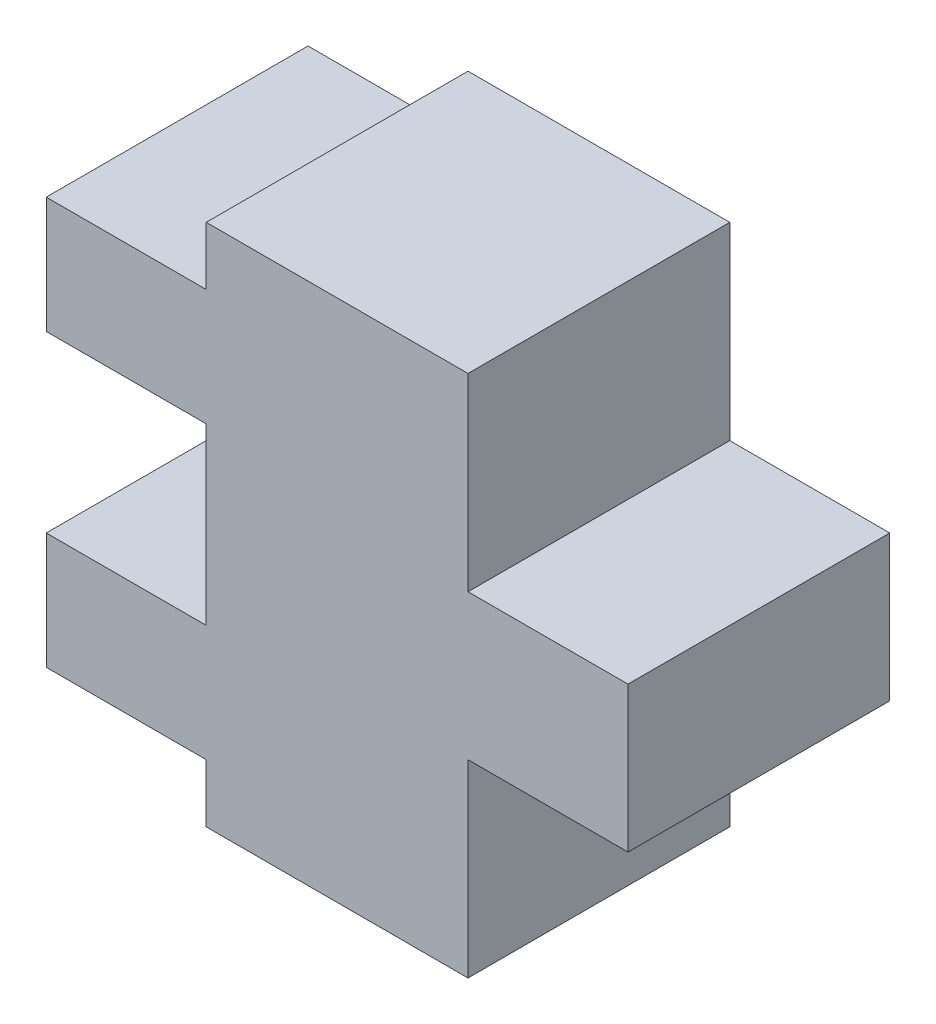
ISO-10303-21;
HEADER;
FILE_DESCRIPTION(('STEP AP214'),'2;1');
FILE_NAME('part.step','',(''),(''),'','','');
FILE_SCHEMA(('AUTOMOTIVE_DESIGN { 1 0 10303 214 1 1 1 1 }'));
ENDSEC;
DATA;
#1=APPLICATION_CONTEXT('core data for automotive mechanical design processes');
#2=APPLICATION_PROTOCOL_DEFINITION('international standard','automotive_design',2000,#1);
#3=PRODUCT_CONTEXT('',#1,'mechanical');
#4=PRODUCT('Part','Part','',(#3));
#5=PRODUCT_RELATED_PRODUCT_CATEGORY('part','',(#4));
#6=PRODUCT_DEFINITION_FORMATION('','',#4);
#7=PRODUCT_DEFINITION_CONTEXT('part definition',#1,'design');
#8=PRODUCT_DEFINITION('design','',#6,#7);
#9=PRODUCT_DEFINITION_SHAPE('','',#8);
#10=(LENGTH_UNIT() NAMED_UNIT(*) SI_UNIT(.MILLI.,.METRE.));
#11=(NAMED_UNIT(*) PLANE_ANGLE_UNIT() SI_UNIT($,.RADIAN.));
#12=(NAMED_UNIT(*) SI_UNIT($,.STERADIAN.) SOLID_ANGLE_UNIT());
#13=UNCERTAINTY_MEASURE_WITH_UNIT(LENGTH_MEASURE(1.E-05),#10,'distance_accuracy_value','');
#14=(GEOMETRIC_REPRESENTATION_CONTEXT(3) GLOBAL_UNCERTAINTY_ASSIGNED_CONTEXT((#13)) GLOBAL_UNIT_ASSIGNED_CONTEXT((#10,
#11,#12)) REPRESENTATION_CONTEXT('',''));
#15=CARTESIAN_POINT('',(0.,0.,0.));
#16=DIRECTION('',(0.,0.,1.));
#17=DIRECTION('',(1.,0.,0.));
#18=AXIS2_PLACEMENT_3D('',#15,#16,#17);
#19=CARTESIAN_POINT('',(1.,0.25,0.9));
#20=DIRECTION('',(-1.,0.,0.));
#21=DIRECTION('',(0.,0.,1.));
#22=AXIS2_PLACEMENT_3D('',#19,#20,#21);
#23=PLANE('',#22);
#24=DIRECTION('',(0.,1.,0.));
#25=VECTOR('',#24,1.);
#26=CARTESIAN_POINT('',(1.,0.25,0.));
#27=LINE('',#26,#25);
#28=CARTESIAN_POINT('',(1.,-0.25,0.));
#29=VERTEX_POINT('',#28);
#30=CARTESIAN_POINT('',(1.,0.25,0.));
#31=VERTEX_POINT('',#30);
#32=EDGE_CURVE('E178',#29,#31,#27,.T.);
#33=ORIENTED_EDGE('',*,*,#32,.T.);
#34=DIRECTION('',(0.,0.,-1.));
#35=VECTOR('',#34,1.);
#36=CARTESIAN_POINT('',(1.,0.25,0.9));
#37=LINE('',#36,#35);
#38=CARTESIAN_POINT('',(1.,0.25,0.9));
#39=VERTEX_POINT('',#38);
#40=EDGE_CURVE('E11',#39,#31,#37,.T.);
#41=ORIENTED_EDGE('',*,*,#40,.F.);
#42=DIRECTION('',(0.,1.,0.));
#43=VECTOR('',#42,1.);
#44=CARTESIAN_POINT('',(1.,0.25,0.9));
#45=LINE('',#44,#43);
#46=CARTESIAN_POINT('',(1.,-0.25,0.9));
#47=VERTEX_POINT('',#46);
#48=EDGE_CURVE('E208',#47,#39,#45,.T.);
#49=ORIENTED_EDGE('',*,*,#48,.F.);
#50=DIRECTION('',(0.,0.,-1.));
#51=VECTOR('',#50,1.);
#52=CARTESIAN_POINT('',(1.,-0.25,0.9));
#53=LINE('',#52,#51);
#54=EDGE_CURVE('E174',#47,#29,#53,.T.);
#55=ORIENTED_EDGE('',*,*,#54,.T.);
#56=EDGE_LOOP('',(#33,#41,#49,#55));
#57=FACE_BOUND('',#56,.T.);
#58=ADVANCED_FACE('F34',(#57),#23,.F.);
#59=CARTESIAN_POINT('',(0.45,0.25,0.9));
#60=DIRECTION('',(0.,-1.,0.));
#61=DIRECTION('',(0.,0.,-1.));
#62=AXIS2_PLACEMENT_3D('',#59,#60,#61);
#63=PLANE('',#62);
#64=DIRECTION('',(-1.,0.,0.));
#65=VECTOR('',#64,1.);
#66=CARTESIAN_POINT('',(0.45,0.25,0.));
#67=LINE('',#66,#65);
#68=CARTESIAN_POINT('',(0.45,0.25,0.));
#69=VERTEX_POINT('',#68);
#70=EDGE_CURVE('E181',#31,#69,#67,.T.);
#71=ORIENTED_EDGE('',*,*,#70,.T.);
#72=DIRECTION('',(0.,0.,-1.));
#73=VECTOR('',#72,1.);
#74=CARTESIAN_POINT('',(0.45,0.25,0.9));
#75=LINE('',#74,#73);
#76=CARTESIAN_POINT('',(0.45,0.25,0.9));
#77=VERTEX_POINT('',#76);
#78=EDGE_CURVE('E42',#77,#69,#75,.T.);
#79=ORIENTED_EDGE('',*,*,#78,.F.);
#80=DIRECTION('',(-1.,0.,0.));
#81=VECTOR('',#80,1.);
#82=CARTESIAN_POINT('',(0.45,0.25,0.9));
#83=LINE('',#82,#81);
#84=EDGE_CURVE('E117',#39,#77,#83,.T.);
#85=ORIENTED_EDGE('',*,*,#84,.F.);
#86=ORIENTED_EDGE('',*,*,#40,.T.);
#87=EDGE_LOOP('',(#71,#79,#85,#86));
#88=FACE_BOUND('',#87,.T.);
#89=ADVANCED_FACE('F306',(#88),#63,.F.);
#90=CARTESIAN_POINT('',(0.45,0.9,0.9));
#91=DIRECTION('',(-1.,0.,0.));
#92=DIRECTION('',(0.,0.,1.));
#93=AXIS2_PLACEMENT_3D('',#90,#91,#92);
#94=PLANE('',#93);
#95=DIRECTION('',(0.,1.,0.));
#96=VECTOR('',#95,1.);
#97=CARTESIAN_POINT('',(0.45,0.9,0.));
#98=LINE('',#97,#96);
#99=CARTESIAN_POINT('',(0.45,0.9,0.));
#100=VERTEX_POINT('',#99);
#101=EDGE_CURVE('E183',#69,#100,#98,.T.);
#102=ORIENTED_EDGE('',*,*,#101,.T.);
#103=DIRECTION('',(0.,0.,-1.));
#104=VECTOR('',#103,1.);
#105=CARTESIAN_POINT('',(0.45,0.9,0.9));
#106=LINE('',#105,#104);
#107=CARTESIAN_POINT('',(0.45,0.9,0.9));
#108=VERTEX_POINT('',#107);
#109=EDGE_CURVE('E239',#108,#100,#106,.T.);
#110=ORIENTED_EDGE('',*,*,#109,.F.);
#111=DIRECTION('',(0.,1.,0.));
#112=VECTOR('',#111,1.);
#113=CARTESIAN_POINT('',(0.45,0.9,0.9));
#114=LINE('',#113,#112);
#115=EDGE_CURVE('E247',#77,#108,#114,.T.);
#116=ORIENTED_EDGE('',*,*,#115,.F.);
#117=ORIENTED_EDGE('',*,*,#78,.T.);
#118=EDGE_LOOP('',(#102,#110,#116,#117));
#119=FACE_BOUND('',#118,.T.);
#120=ADVANCED_FACE('F245',(#119),#94,.F.);
#121=CARTESIAN_POINT('',(-0.45,0.9,0.9));
#122=DIRECTION('',(0.,-1.,0.));
#123=DIRECTION('',(0.,0.,-1.));
#124=AXIS2_PLACEMENT_3D('',#121,#122,#123);
#125=PLANE('',#124);
#126=DIRECTION('',(-1.,0.,0.));
#127=VECTOR('',#126,1.);
#128=CARTESIAN_POINT('',(-0.45,0.9,0.));
#129=LINE('',#128,#127);
#130=CARTESIAN_POINT('',(-0.45,0.9,0.));
#131=VERTEX_POINT('',#130);
#132=EDGE_CURVE('E185',#100,#131,#129,.T.);
#133=ORIENTED_EDGE('',*,*,#132,.T.);
#134=DIRECTION('',(0.,0.,-1.));
#135=VECTOR('',#134,1.);
#136=CARTESIAN_POINT('',(-0.45,0.9,0.9));
#137=LINE('',#136,#135);
#138=CARTESIAN_POINT('',(-0.45,0.9,0.9));
#139=VERTEX_POINT('',#138);
#140=EDGE_CURVE('E236',#139,#131,#137,.T.);
#141=ORIENTED_EDGE('',*,*,#140,.F.);
#142=DIRECTION('',(-1.,0.,0.));
#143=VECTOR('',#142,1.);
#144=CARTESIAN_POINT('',(-0.45,0.9,0.9));
#145=LINE('',#144,#143);
#146=EDGE_CURVE('E265',#108,#139,#145,.T.);
#147=ORIENTED_EDGE('',*,*,#146,.F.);
#148=ORIENTED_EDGE('',*,*,#109,.T.);
#149=EDGE_LOOP('',(#133,#141,#147,#148));
#150=FACE_BOUND('',#149,.T.);
#151=ADVANCED_FACE('F256',(#150),#125,.F.);
#152=CARTESIAN_POINT('',(-0.45,0.7,0.9));
#153=DIRECTION('',(1.,0.,0.));
#154=DIRECTION('',(0.,0.,-1.));
#155=AXIS2_PLACEMENT_3D('',#152,#153,#154);
#156=PLANE('',#155);
#157=DIRECTION('',(0.,-1.,0.));
#158=VECTOR('',#157,1.);
#159=CARTESIAN_POINT('',(-0.45,0.7,0.));
#160=LINE('',#159,#158);
#161=CARTESIAN_POINT('',(-0.45,0.7,0.));
#162=VERTEX_POINT('',#161);
#163=EDGE_CURVE('E187',#131,#162,#160,.T.);
#164=ORIENTED_EDGE('',*,*,#163,.T.);
#165=DIRECTION('',(0.,0.,-1.));
#166=VECTOR('',#165,1.);
#167=CARTESIAN_POINT('',(-0.45,0.7,0.9));
#168=LINE('',#167,#166);
#169=CARTESIAN_POINT('',(-0.45,0.7,0.9));
#170=VERTEX_POINT('',#169);
#171=EDGE_CURVE('E233',#170,#162,#168,.T.);
#172=ORIENTED_EDGE('',*,*,#171,.F.);
#173=DIRECTION('',(0.,-1.,0.));
#174=VECTOR('',#173,1.);
#175=CARTESIAN_POINT('',(-0.45,0.7,0.9));
#176=LINE('',#175,#174);
#177=EDGE_CURVE('E262',#139,#170,#176,.T.);
#178=ORIENTED_EDGE('',*,*,#177,.F.);
#179=ORIENTED_EDGE('',*,*,#140,.T.);
#180=EDGE_LOOP('',(#164,#172,#178,#179));
#181=FACE_BOUND('',#180,.T.);
#182=ADVANCED_FACE('F260',(#181),#156,.F.);
#183=CARTESIAN_POINT('',(-1.,0.7,0.9));
#184=DIRECTION('',(0.,-1.,0.));
#185=DIRECTION('',(0.,0.,-1.));
#186=AXIS2_PLACEMENT_3D('',#183,#184,#185);
#187=PLANE('',#186);
#188=DIRECTION('',(-1.,0.,0.));
#189=VECTOR('',#188,1.);
#190=CARTESIAN_POINT('',(-1.,0.7,0.));
#191=LINE('',#190,#189);
#192=CARTESIAN_POINT('',(-1.,0.7,0.));
#193=VERTEX_POINT('',#192);
#194=EDGE_CURVE('E189',#162,#193,#191,.T.);
#195=ORIENTED_EDGE('',*,*,#194,.T.);
#196=DIRECTION('',(0.,0.,-1.));
#197=VECTOR('',#196,1.);
#198=CARTESIAN_POINT('',(-1.,0.7,0.9));
#199=LINE('',#198,#197);
#200=CARTESIAN_POINT('',(-1.,0.7,0.9));
#201=VERTEX_POINT('',#200);
#202=EDGE_CURVE('E230',#201,#193,#199,.T.);
#203=ORIENTED_EDGE('',*,*,#202,.F.);
#204=DIRECTION('',(-1.,0.,0.));
#205=VECTOR('',#204,1.);
#206=CARTESIAN_POINT('',(-1.,0.7,0.9));
#207=LINE('',#206,#205);
#208=EDGE_CURVE('E264',#170,#201,#207,.T.);
#209=ORIENTED_EDGE('',*,*,#208,.F.);
#210=ORIENTED_EDGE('',*,*,#171,.T.);
#211=EDGE_LOOP('',(#195,#203,#209,#210));
#212=FACE_BOUND('',#211,.T.);
#213=ADVANCED_FACE('F319',(#212),#187,.F.);
#214=CARTESIAN_POINT('',(-1.,0.3,0.9));
#215=DIRECTION('',(1.,0.,0.));
#216=DIRECTION('',(0.,0.,-1.));
#217=AXIS2_PLACEMENT_3D('',#214,#215,#216);
#218=PLANE('',#217);
#219=DIRECTION('',(0.,-1.,0.));
#220=VECTOR('',#219,1.);
#221=CARTESIAN_POINT('',(-1.,0.3,0.));
#222=LINE('',#221,#220);
#223=CARTESIAN_POINT('',(-1.,0.3,0.));
#224=VERTEX_POINT('',#223);
#225=EDGE_CURVE('E191',#193,#224,#222,.T.);
#226=ORIENTED_EDGE('',*,*,#225,.T.);
#227=DIRECTION('',(0.,0.,-1.));
#228=VECTOR('',#227,1.);
#229=CARTESIAN_POINT('',(-1.,0.3,0.9));
#230=LINE('',#229,#228);
#231=CARTESIAN_POINT('',(-1.,0.3,0.9));
#232=VERTEX_POINT('',#231);
#233=EDGE_CURVE('E227',#232,#224,#230,.T.);
#234=ORIENTED_EDGE('',*,*,#233,.F.);
#235=DIRECTION('',(0.,-1.,0.));
#236=VECTOR('',#235,1.);
#237=CARTESIAN_POINT('',(-1.,0.3,0.9));
#238=LINE('',#237,#236);
#239=EDGE_CURVE('E267',#201,#232,#238,.T.);
#240=ORIENTED_EDGE('',*,*,#239,.F.);
#241=ORIENTED_EDGE('',*,*,#202,.T.);
#242=EDGE_LOOP('',(#226,#234,#240,#241));
#243=FACE_BOUND('',#242,.T.);
#244=ADVANCED_FACE('F322',(#243),#218,.F.);
#245=CARTESIAN_POINT('',(-0.45,0.3,0.9));
#246=DIRECTION('',(0.,1.,0.));
#247=DIRECTION('',(0.,0.,1.));
#248=AXIS2_PLACEMENT_3D('',#245,#246,#247);
#249=PLANE('',#248);
#250=DIRECTION('',(1.,0.,0.));
#251=VECTOR('',#250,1.);
#252=CARTESIAN_POINT('',(-0.45,0.3,0.));
#253=LINE('',#252,#251);
#254=CARTESIAN_POINT('',(-0.45,0.3,0.));
#255=VERTEX_POINT('',#254);
#256=EDGE_CURVE('E193',#224,#255,#253,.T.);
#257=ORIENTED_EDGE('',*,*,#256,.T.);
#258=DIRECTION('',(0.,0.,-1.));
#259=VECTOR('',#258,1.);
#260=CARTESIAN_POINT('',(-0.45,0.3,0.9));
#261=LINE('',#260,#259);
#262=CARTESIAN_POINT('',(-0.45,0.3,0.9));
#263=VERTEX_POINT('',#262);
#264=EDGE_CURVE('E224',#263,#255,#261,.T.);
#265=ORIENTED_EDGE('',*,*,#264,.F.);
#266=DIRECTION('',(1.,0.,0.));
#267=VECTOR('',#266,1.);
#268=CARTESIAN_POINT('',(-0.45,0.3,0.9));
#269=LINE('',#268,#267);
#270=EDGE_CURVE('E273',#232,#263,#269,.T.);
#271=ORIENTED_EDGE('',*,*,#270,.F.);
#272=ORIENTED_EDGE('',*,*,#233,.T.);
#273=EDGE_LOOP('',(#257,#265,#271,#272));
#274=FACE_BOUND('',#273,.T.);
#275=ADVANCED_FACE('F326',(#274),#249,.F.);
#276=CARTESIAN_POINT('',(-0.45,-0.3,0.9));
#277=DIRECTION('',(1.,0.,0.));
#278=DIRECTION('',(0.,0.,-1.));
#279=AXIS2_PLACEMENT_3D('',#276,#277,#278);
#280=PLANE('',#279);
#281=DIRECTION('',(0.,-1.,0.));
#282=VECTOR('',#281,1.);
#283=CARTESIAN_POINT('',(-0.45,-0.3,0.));
#284=LINE('',#283,#282);
#285=CARTESIAN_POINT('',(-0.45,-0.3,0.));
#286=VERTEX_POINT('',#285);
#287=EDGE_CURVE('E195',#255,#286,#284,.T.);
#288=ORIENTED_EDGE('',*,*,#287,.T.);
#289=DIRECTION('',(0.,0.,-1.));
#290=VECTOR('',#289,1.);
#291=CARTESIAN_POINT('',(-0.45,-0.3,0.9));
#292=LINE('',#291,#290);
#293=CARTESIAN_POINT('',(-0.45,-0.3,0.9));
#294=VERTEX_POINT('',#293);
#295=EDGE_CURVE('E221',#294,#286,#292,.T.);
#296=ORIENTED_EDGE('',*,*,#295,.F.);
#297=DIRECTION('',(0.,-1.,0.));
#298=VECTOR('',#297,1.);
#299=CARTESIAN_POINT('',(-0.45,-0.3,0.9));
#300=LINE('',#299,#298);
#301=EDGE_CURVE('E275',#263,#294,#300,.T.);
#302=ORIENTED_EDGE('',*,*,#301,.F.);
#303=ORIENTED_EDGE('',*,*,#264,.T.);
#304=EDGE_LOOP('',(#288,#296,#302,#303));
#305=FACE_BOUND('',#304,.T.);
#306=ADVANCED_FACE('F330',(#305),#280,.F.);
#307=CARTESIAN_POINT('',(-1.,-0.3,0.9));
#308=DIRECTION('',(0.,-1.,0.));
#309=DIRECTION('',(0.,0.,-1.));
#310=AXIS2_PLACEMENT_3D('',#307,#308,#309);
#311=PLANE('',#310);
#312=DIRECTION('',(-1.,0.,0.));
#313=VECTOR('',#312,1.);
#314=CARTESIAN_POINT('',(-1.,-0.3,0.));
#315=LINE('',#314,#313);
#316=CARTESIAN_POINT('',(-1.,-0.3,0.));
#317=VERTEX_POINT('',#316);
#318=EDGE_CURVE('E197',#286,#317,#315,.T.);
#319=ORIENTED_EDGE('',*,*,#318,.T.);
#320=DIRECTION('',(0.,0.,-1.));
#321=VECTOR('',#320,1.);
#322=CARTESIAN_POINT('',(-1.,-0.3,0.9));
#323=LINE('',#322,#321);
#324=CARTESIAN_POINT('',(-1.,-0.3,0.9));
#325=VERTEX_POINT('',#324);
#326=EDGE_CURVE('E218',#325,#317,#323,.T.);
#327=ORIENTED_EDGE('',*,*,#326,.F.);
#328=DIRECTION('',(-1.,0.,0.));
#329=VECTOR('',#328,1.);
#330=CARTESIAN_POINT('',(-1.,-0.3,0.9));
#331=LINE('',#330,#329);
#332=EDGE_CURVE('E277',#294,#325,#331,.T.);
#333=ORIENTED_EDGE('',*,*,#332,.F.);
#334=ORIENTED_EDGE('',*,*,#295,.T.);
#335=EDGE_LOOP('',(#319,#327,#333,#334));
#336=FACE_BOUND('',#335,.T.);
#337=ADVANCED_FACE('F334',(#336),#311,.F.);
#338=CARTESIAN_POINT('',(-1.,-0.7,0.9));
#339=DIRECTION('',(1.,0.,0.));
#340=DIRECTION('',(0.,0.,-1.));
#341=AXIS2_PLACEMENT_3D('',#338,#339,#340);
#342=PLANE('',#341);
#343=DIRECTION('',(0.,-1.,0.));
#344=VECTOR('',#343,1.);
#345=CARTESIAN_POINT('',(-1.,-0.7,0.));
#346=LINE('',#345,#344);
#347=CARTESIAN_POINT('',(-1.,-0.7,0.));
#348=VERTEX_POINT('',#347);
#349=EDGE_CURVE('E199',#317,#348,#346,.T.);
#350=ORIENTED_EDGE('',*,*,#349,.T.);
#351=DIRECTION('',(0.,0.,-1.));
#352=VECTOR('',#351,1.);
#353=CARTESIAN_POINT('',(-1.,-0.7,0.9));
#354=LINE('',#353,#352);
#355=CARTESIAN_POINT('',(-1.,-0.7,0.9));
#356=VERTEX_POINT('',#355);
#357=EDGE_CURVE('E215',#356,#348,#354,.T.);
#358=ORIENTED_EDGE('',*,*,#357,.F.);
#359=DIRECTION('',(0.,-1.,0.));
#360=VECTOR('',#359,1.);
#361=CARTESIAN_POINT('',(-1.,-0.7,0.9));
#362=LINE('',#361,#360);
#363=EDGE_CURVE('E279',#325,#356,#362,.T.);
#364=ORIENTED_EDGE('',*,*,#363,.F.);
#365=ORIENTED_EDGE('',*,*,#326,.T.);
#366=EDGE_LOOP('',(#350,#358,#364,#365));
#367=FACE_BOUND('',#366,.T.);
#368=ADVANCED_FACE('F338',(#367),#342,.F.);
#369=CARTESIAN_POINT('',(-0.45,-0.7,0.9));
#370=DIRECTION('',(0.,1.,0.));
#371=DIRECTION('',(0.,0.,1.));
#372=AXIS2_PLACEMENT_3D('',#369,#370,#371);
#373=PLANE('',#372);
#374=DIRECTION('',(1.,0.,0.));
#375=VECTOR('',#374,1.);
#376=CARTESIAN_POINT('',(-0.45,-0.7,0.));
#377=LINE('',#376,#375);
#378=CARTESIAN_POINT('',(-0.45,-0.7,0.));
#379=VERTEX_POINT('',#378);
#380=EDGE_CURVE('E201',#348,#379,#377,.T.);
#381=ORIENTED_EDGE('',*,*,#380,.T.);
#382=DIRECTION('',(0.,0.,-1.));
#383=VECTOR('',#382,1.);
#384=CARTESIAN_POINT('',(-0.45,-0.7,0.9));
#385=LINE('',#384,#383);
#386=CARTESIAN_POINT('',(-0.45,-0.7,0.9));
#387=VERTEX_POINT('',#386);
#388=EDGE_CURVE('E212',#387,#379,#385,.T.);
#389=ORIENTED_EDGE('',*,*,#388,.F.);
#390=DIRECTION('',(1.,0.,0.));
#391=VECTOR('',#390,1.);
#392=CARTESIAN_POINT('',(-0.45,-0.7,0.9));
#393=LINE('',#392,#391);
#394=EDGE_CURVE('E281',#356,#387,#393,.T.);
#395=ORIENTED_EDGE('',*,*,#394,.F.);
#396=ORIENTED_EDGE('',*,*,#357,.T.);
#397=EDGE_LOOP('',(#381,#389,#395,#396));
#398=FACE_BOUND('',#397,.T.);
#399=ADVANCED_FACE('F287',(#398),#373,.F.);
#400=CARTESIAN_POINT('',(-0.45,-0.9,0.9));
#401=DIRECTION('',(1.,0.,0.));
#402=DIRECTION('',(0.,0.,-1.));
#403=AXIS2_PLACEMENT_3D('',#400,#401,#402);
#404=PLANE('',#403);
#405=DIRECTION('',(0.,-1.,0.));
#406=VECTOR('',#405,1.);
#407=CARTESIAN_POINT('',(-0.45,-0.9,0.));
#408=LINE('',#407,#406);
#409=CARTESIAN_POINT('',(-0.45,-0.9,0.));
#410=VERTEX_POINT('',#409);
#411=EDGE_CURVE('E203',#379,#410,#408,.T.);
#412=ORIENTED_EDGE('',*,*,#411,.T.);
#413=DIRECTION('',(0.,0.,-1.));
#414=VECTOR('',#413,1.);
#415=CARTESIAN_POINT('',(-0.45,-0.9,0.9));
#416=LINE('',#415,#414);
#417=CARTESIAN_POINT('',(-0.45,-0.9,0.9));
#418=VERTEX_POINT('',#417);
#419=EDGE_CURVE('E169',#418,#410,#416,.T.);
#420=ORIENTED_EDGE('',*,*,#419,.F.);
#421=DIRECTION('',(0.,-1.,0.));
#422=VECTOR('',#421,1.);
#423=CARTESIAN_POINT('',(-0.45,-0.9,0.9));
#424=LINE('',#423,#422);
#425=EDGE_CURVE('E160',#387,#418,#424,.T.);
#426=ORIENTED_EDGE('',*,*,#425,.F.);
#427=ORIENTED_EDGE('',*,*,#388,.T.);
#428=EDGE_LOOP('',(#412,#420,#426,#427));
#429=FACE_BOUND('',#428,.T.);
#430=ADVANCED_FACE('F291',(#429),#404,.F.);
#431=CARTESIAN_POINT('',(0.45,-0.9,0.9));
#432=DIRECTION('',(0.,1.,0.));
#433=DIRECTION('',(0.,0.,1.));
#434=AXIS2_PLACEMENT_3D('',#431,#432,#433);
#435=PLANE('',#434);
#436=DIRECTION('',(1.,0.,0.));
#437=VECTOR('',#436,1.);
#438=CARTESIAN_POINT('',(0.45,-0.9,0.));
#439=LINE('',#438,#437);
#440=CARTESIAN_POINT('',(0.45,-0.9,0.));
#441=VERTEX_POINT('',#440);
#442=EDGE_CURVE('E168',#410,#441,#439,.T.);
#443=ORIENTED_EDGE('',*,*,#442,.T.);
#444=DIRECTION('',(0.,0.,-1.));
#445=VECTOR('',#444,1.);
#446=CARTESIAN_POINT('',(0.45,-0.9,0.9));
#447=LINE('',#446,#445);
#448=CARTESIAN_POINT('',(0.45,-0.9,0.9));
#449=VERTEX_POINT('',#448);
#450=EDGE_CURVE('E165',#449,#441,#447,.T.);
#451=ORIENTED_EDGE('',*,*,#450,.F.);
#452=DIRECTION('',(1.,0.,0.));
#453=VECTOR('',#452,1.);
#454=CARTESIAN_POINT('',(0.45,-0.9,0.9));
#455=LINE('',#454,#453);
#456=EDGE_CURVE('E154',#418,#449,#455,.T.);
#457=ORIENTED_EDGE('',*,*,#456,.F.);
#458=ORIENTED_EDGE('',*,*,#419,.T.);
#459=EDGE_LOOP('',(#443,#451,#457,#458));
#460=FACE_BOUND('',#459,.T.);
#461=ADVANCED_FACE('F166',(#460),#435,.F.);
#462=CARTESIAN_POINT('',(0.45,-0.25,0.9));
#463=DIRECTION('',(-1.,0.,0.));
#464=DIRECTION('',(0.,0.,1.));
#465=AXIS2_PLACEMENT_3D('',#462,#463,#464);
#466=PLANE('',#465);
#467=DIRECTION('',(0.,1.,0.));
#468=VECTOR('',#467,1.);
#469=CARTESIAN_POINT('',(0.45,-0.25,0.));
#470=LINE('',#469,#468);
#471=CARTESIAN_POINT('',(0.45,-0.25,0.));
#472=VERTEX_POINT('',#471);
#473=EDGE_CURVE('E103',#441,#472,#470,.T.);
#474=ORIENTED_EDGE('',*,*,#473,.T.);
#475=DIRECTION('',(0.,0.,-1.));
#476=VECTOR('',#475,1.);
#477=CARTESIAN_POINT('',(0.45,-0.25,0.9));
#478=LINE('',#477,#476);
#479=CARTESIAN_POINT('',(0.45,-0.25,0.9));
#480=VERTEX_POINT('',#479);
#481=EDGE_CURVE('E170',#480,#472,#478,.T.);
#482=ORIENTED_EDGE('',*,*,#481,.F.);
#483=DIRECTION('',(0.,1.,0.));
#484=VECTOR('',#483,1.);
#485=CARTESIAN_POINT('',(0.45,-0.25,0.9));
#486=LINE('',#485,#484);
#487=EDGE_CURVE('E158',#449,#480,#486,.T.);
#488=ORIENTED_EDGE('',*,*,#487,.F.);
#489=ORIENTED_EDGE('',*,*,#450,.T.);
#490=EDGE_LOOP('',(#474,#482,#488,#489));
#491=FACE_BOUND('',#490,.T.);
#492=ADVANCED_FACE('F172',(#491),#466,.F.);
#493=CARTESIAN_POINT('',(1.,-0.25,0.9));
#494=DIRECTION('',(0.,1.,0.));
#495=DIRECTION('',(0.,0.,1.));
#496=AXIS2_PLACEMENT_3D('',#493,#494,#495);
#497=PLANE('',#496);
#498=DIRECTION('',(1.,0.,0.));
#499=VECTOR('',#498,1.);
#500=CARTESIAN_POINT('',(1.,-0.25,0.));
#501=LINE('',#500,#499);
#502=EDGE_CURVE('E109',#472,#29,#501,.T.);
#503=ORIENTED_EDGE('',*,*,#502,.T.);
#504=ORIENTED_EDGE('',*,*,#54,.F.);
#505=DIRECTION('',(1.,0.,0.));
#506=VECTOR('',#505,1.);
#507=CARTESIAN_POINT('',(1.,-0.25,0.9));
#508=LINE('',#507,#506);
#509=EDGE_CURVE('E50',#480,#47,#508,.T.);
#510=ORIENTED_EDGE('',*,*,#509,.F.);
#511=ORIENTED_EDGE('',*,*,#481,.T.);
#512=EDGE_LOOP('',(#503,#504,#510,#511));
#513=FACE_BOUND('',#512,.T.);
#514=ADVANCED_FACE('F295',(#513),#497,.F.);
#515=CARTESIAN_POINT('',(0.,0.,0.9));
#516=DIRECTION('',(0.,0.,-1.));
#517=DIRECTION('',(-1.,0.,0.));
#518=AXIS2_PLACEMENT_3D('',#515,#516,#517);
#519=PLANE('',#518);
#520=ORIENTED_EDGE('',*,*,#48,.T.);
#521=ORIENTED_EDGE('',*,*,#84,.T.);
#522=ORIENTED_EDGE('',*,*,#115,.T.);
#523=ORIENTED_EDGE('',*,*,#146,.T.);
#524=ORIENTED_EDGE('',*,*,#177,.T.);
#525=ORIENTED_EDGE('',*,*,#208,.T.);
#526=ORIENTED_EDGE('',*,*,#239,.T.);
#527=ORIENTED_EDGE('',*,*,#270,.T.);
#528=ORIENTED_EDGE('',*,*,#301,.T.);
#529=ORIENTED_EDGE('',*,*,#332,.T.);
#530=ORIENTED_EDGE('',*,*,#363,.T.);
#531=ORIENTED_EDGE('',*,*,#394,.T.);
#532=ORIENTED_EDGE('',*,*,#425,.T.);
#533=ORIENTED_EDGE('',*,*,#456,.T.);
#534=ORIENTED_EDGE('',*,*,#487,.T.);
#535=ORIENTED_EDGE('',*,*,#509,.T.);
#536=EDGE_LOOP('',(#520,#521,#522,#523,#524,#525,#526,#527,#528,#529,#530,#531,#532,#533,#534,#535));
#537=FACE_BOUND('',#536,.T.);
#538=ADVANCED_FACE('F156',(#537),#519,.F.);
#539=CARTESIAN_POINT('',(0.,0.,0.));
#540=DIRECTION('',(0.,0.,-1.));
#541=DIRECTION('',(-1.,0.,0.));
#542=AXIS2_PLACEMENT_3D('',#539,#540,#541);
#543=PLANE('',#542);
#544=ORIENTED_EDGE('',*,*,#32,.F.);
#545=ORIENTED_EDGE('',*,*,#502,.F.);
#546=ORIENTED_EDGE('',*,*,#473,.F.);
#547=ORIENTED_EDGE('',*,*,#442,.F.);
#548=ORIENTED_EDGE('',*,*,#411,.F.);
#549=ORIENTED_EDGE('',*,*,#380,.F.);
#550=ORIENTED_EDGE('',*,*,#349,.F.);
#551=ORIENTED_EDGE('',*,*,#318,.F.);
#552=ORIENTED_EDGE('',*,*,#287,.F.);
#553=ORIENTED_EDGE('',*,*,#256,.F.);
#554=ORIENTED_EDGE('',*,*,#225,.F.);
#555=ORIENTED_EDGE('',*,*,#194,.F.);
#556=ORIENTED_EDGE('',*,*,#163,.F.);
#557=ORIENTED_EDGE('',*,*,#132,.F.);
#558=ORIENTED_EDGE('',*,*,#101,.F.);
#559=ORIENTED_EDGE('',*,*,#70,.F.);
#560=EDGE_LOOP('',(#544,#545,#546,#547,#548,#549,#550,#551,#552,#553,#554,#555,#556,#557,#558,#559));
#561=FACE_BOUND('',#560,.T.);
#562=ADVANCED_FACE('F251',(#561),#543,.T.);
#563=CLOSED_SHELL('',(#58,#89,#120,#151,#182,#213,#244,#275,#306,#337,#368,#399,#430,#461,#492,
#514,#538,#562));
#564=MANIFOLD_SOLID_BREP('B2',#563);
#565=ADVANCED_BREP_SHAPE_REPRESENTATION('',(#18,#564),#14);
#566=SHAPE_DEFINITION_REPRESENTATION(#9,#565);
ENDSEC;
END-ISO-10303-21;
